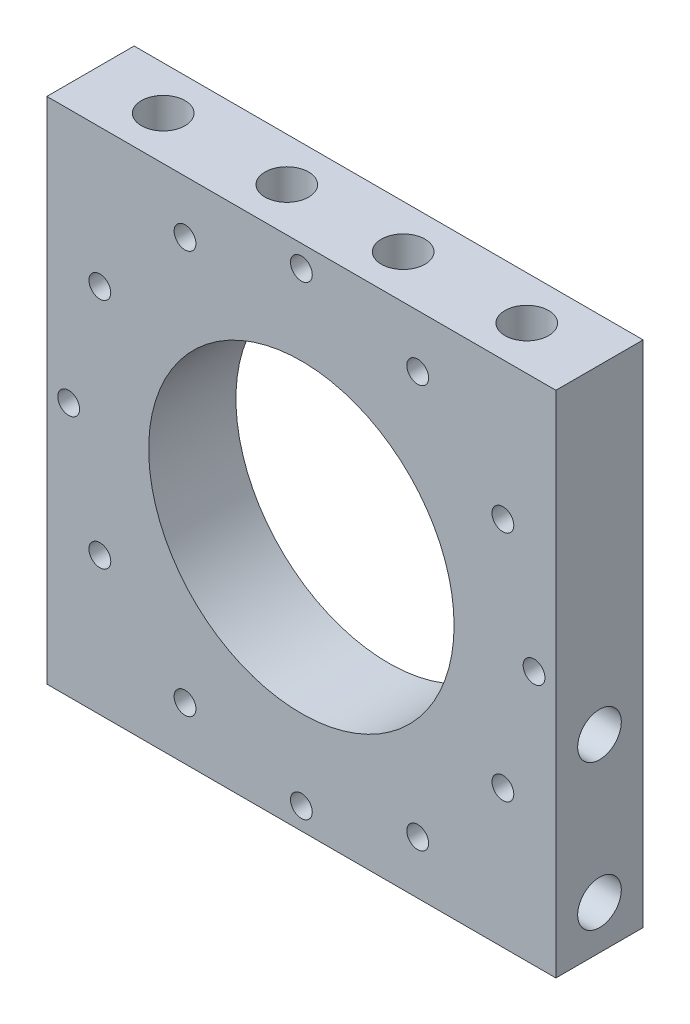
ISO-10303-21;
HEADER;
FILE_DESCRIPTION(('STEP AP214'),'2;1');
FILE_NAME('part.step','',(''),(''),'','','');
FILE_SCHEMA(('AUTOMOTIVE_DESIGN { 1 0 10303 214 1 1 1 1 }'));
ENDSEC;
DATA;
#1=APPLICATION_CONTEXT('core data for automotive mechanical design processes');
#2=APPLICATION_PROTOCOL_DEFINITION('international standard','automotive_design',2000,#1);
#3=PRODUCT_CONTEXT('',#1,'mechanical');
#4=PRODUCT('Part','Part','',(#3));
#5=PRODUCT_RELATED_PRODUCT_CATEGORY('part','',(#4));
#6=PRODUCT_DEFINITION_FORMATION('','',#4);
#7=PRODUCT_DEFINITION_CONTEXT('part definition',#1,'design');
#8=PRODUCT_DEFINITION('design','',#6,#7);
#9=PRODUCT_DEFINITION_SHAPE('','',#8);
#10=(LENGTH_UNIT() NAMED_UNIT(*) SI_UNIT(.MILLI.,.METRE.));
#11=(NAMED_UNIT(*) PLANE_ANGLE_UNIT() SI_UNIT($,.RADIAN.));
#12=(NAMED_UNIT(*) SI_UNIT($,.STERADIAN.) SOLID_ANGLE_UNIT());
#13=UNCERTAINTY_MEASURE_WITH_UNIT(LENGTH_MEASURE(1.E-05),#10,'distance_accuracy_value','');
#14=(GEOMETRIC_REPRESENTATION_CONTEXT(3) GLOBAL_UNCERTAINTY_ASSIGNED_CONTEXT((#13)) GLOBAL_UNIT_ASSIGNED_CONTEXT((#10,
#11,#12)) REPRESENTATION_CONTEXT('',''));
#15=CARTESIAN_POINT('',(0.,0.,0.));
#16=DIRECTION('',(0.,0.,1.));
#17=DIRECTION('',(1.,0.,0.));
#18=AXIS2_PLACEMENT_3D('',#15,#16,#17);
#19=CARTESIAN_POINT('',(0.,0.,12.));
#20=DIRECTION('',(0.,0.,-1.));
#21=DIRECTION('',(-1.,0.,0.));
#22=AXIS2_PLACEMENT_3D('',#19,#20,#21);
#23=PLANE('',#22);
#24=DIRECTION('',(0.,1.,0.));
#25=VECTOR('',#24,1.);
#26=CARTESIAN_POINT('',(35.,-35.,12.));
#27=LINE('',#26,#25);
#28=CARTESIAN_POINT('',(35.,-35.,12.));
#29=VERTEX_POINT('',#28);
#30=CARTESIAN_POINT('',(35.,35.,12.));
#31=VERTEX_POINT('',#30);
#32=EDGE_CURVE('E85',#29,#31,#27,.T.);
#33=ORIENTED_EDGE('',*,*,#32,.T.);
#34=DIRECTION('',(-1.,0.,0.));
#35=VECTOR('',#34,1.);
#36=CARTESIAN_POINT('',(-35.,35.,12.));
#37=LINE('',#36,#35);
#38=CARTESIAN_POINT('',(-35.,35.,12.));
#39=VERTEX_POINT('',#38);
#40=EDGE_CURVE('E80',#31,#39,#37,.T.);
#41=ORIENTED_EDGE('',*,*,#40,.T.);
#42=DIRECTION('',(0.,-1.,0.));
#43=VECTOR('',#42,1.);
#44=CARTESIAN_POINT('',(-35.,-35.,12.));
#45=LINE('',#44,#43);
#46=CARTESIAN_POINT('',(-35.,-35.,12.));
#47=VERTEX_POINT('',#46);
#48=EDGE_CURVE('E83',#39,#47,#45,.T.);
#49=ORIENTED_EDGE('',*,*,#48,.T.);
#50=DIRECTION('',(1.,0.,0.));
#51=VECTOR('',#50,1.);
#52=CARTESIAN_POINT('',(-35.,-35.,12.));
#53=LINE('',#52,#51);
#54=EDGE_CURVE('E50',#47,#29,#53,.T.);
#55=ORIENTED_EDGE('',*,*,#54,.T.);
#56=EDGE_LOOP('',(#33,#41,#49,#55));
#57=FACE_BOUND('',#56,.T.);
#58=CARTESIAN_POINT('',(-16.,27.712812921102,12.));
#59=DIRECTION('',(0.,0.,1.));
#60=DIRECTION('',(1.,0.,0.));
#61=AXIS2_PLACEMENT_3D('',#58,#59,#60);
#62=CIRCLE('',#61,1.5);
#63=CARTESIAN_POINT('',(-14.5,27.712812921102,12.));
#64=VERTEX_POINT('',#63);
#65=EDGE_CURVE('E100',#64,#64,#62,.T.);
#66=ORIENTED_EDGE('',*,*,#65,.F.);
#67=EDGE_LOOP('',(#66));
#68=FACE_BOUND('',#67,.T.);
#69=CARTESIAN_POINT('',(0.,32.,12.));
#70=DIRECTION('',(0.,0.,1.));
#71=DIRECTION('',(1.,0.,0.));
#72=AXIS2_PLACEMENT_3D('',#69,#70,#71);
#73=CIRCLE('',#72,1.5);
#74=CARTESIAN_POINT('',(1.5,32.,12.));
#75=VERTEX_POINT('',#74);
#76=EDGE_CURVE('E115',#75,#75,#73,.T.);
#77=ORIENTED_EDGE('',*,*,#76,.F.);
#78=EDGE_LOOP('',(#77));
#79=FACE_BOUND('',#78,.T.);
#80=CARTESIAN_POINT('',(16.,27.7128129211021,12.));
#81=DIRECTION('',(0.,0.,1.));
#82=DIRECTION('',(1.,0.,0.));
#83=AXIS2_PLACEMENT_3D('',#80,#81,#82);
#84=CIRCLE('',#83,1.5);
#85=CARTESIAN_POINT('',(17.5,27.7128129211021,12.));
#86=VERTEX_POINT('',#85);
#87=EDGE_CURVE('E121',#86,#86,#84,.T.);
#88=ORIENTED_EDGE('',*,*,#87,.F.);
#89=EDGE_LOOP('',(#88));
#90=FACE_BOUND('',#89,.T.);
#91=CARTESIAN_POINT('',(27.712812921102,16.,12.));
#92=DIRECTION('',(0.,0.,1.));
#93=DIRECTION('',(1.,0.,0.));
#94=AXIS2_PLACEMENT_3D('',#91,#92,#93);
#95=CIRCLE('',#94,1.5);
#96=CARTESIAN_POINT('',(29.212812921102,16.,12.));
#97=VERTEX_POINT('',#96);
#98=EDGE_CURVE('E127',#97,#97,#95,.T.);
#99=ORIENTED_EDGE('',*,*,#98,.F.);
#100=EDGE_LOOP('',(#99));
#101=FACE_BOUND('',#100,.T.);
#102=CARTESIAN_POINT('',(32.,0.,12.));
#103=DIRECTION('',(0.,0.,1.));
#104=DIRECTION('',(1.,0.,0.));
#105=AXIS2_PLACEMENT_3D('',#102,#103,#104);
#106=CIRCLE('',#105,1.5);
#107=CARTESIAN_POINT('',(33.5,0.,12.));
#108=VERTEX_POINT('',#107);
#109=EDGE_CURVE('E133',#108,#108,#106,.T.);
#110=ORIENTED_EDGE('',*,*,#109,.F.);
#111=EDGE_LOOP('',(#110));
#112=FACE_BOUND('',#111,.T.);
#113=CARTESIAN_POINT('',(0.,0.,12.));
#114=DIRECTION('',(0.,0.,1.));
#115=DIRECTION('',(1.,0.,0.));
#116=AXIS2_PLACEMENT_3D('',#113,#114,#115);
#117=CIRCLE('',#116,21.);
#118=CARTESIAN_POINT('',(21.,0.,12.));
#119=VERTEX_POINT('',#118);
#120=EDGE_CURVE('E139',#119,#119,#117,.T.);
#121=ORIENTED_EDGE('',*,*,#120,.F.);
#122=EDGE_LOOP('',(#121));
#123=FACE_BOUND('',#122,.T.);
#124=CARTESIAN_POINT('',(27.712812921102,-16.,12.));
#125=DIRECTION('',(0.,0.,1.));
#126=DIRECTION('',(1.,0.,0.));
#127=AXIS2_PLACEMENT_3D('',#124,#125,#126);
#128=CIRCLE('',#127,1.5);
#129=CARTESIAN_POINT('',(29.212812921102,-16.,12.));
#130=VERTEX_POINT('',#129);
#131=EDGE_CURVE('E145',#130,#130,#128,.T.);
#132=ORIENTED_EDGE('',*,*,#131,.F.);
#133=EDGE_LOOP('',(#132));
#134=FACE_BOUND('',#133,.T.);
#135=CARTESIAN_POINT('',(16.,-27.712812921102,12.));
#136=DIRECTION('',(0.,0.,1.));
#137=DIRECTION('',(1.,0.,0.));
#138=AXIS2_PLACEMENT_3D('',#135,#136,#137);
#139=CIRCLE('',#138,1.5);
#140=CARTESIAN_POINT('',(17.5,-27.712812921102,12.));
#141=VERTEX_POINT('',#140);
#142=EDGE_CURVE('E151',#141,#141,#139,.T.);
#143=ORIENTED_EDGE('',*,*,#142,.F.);
#144=EDGE_LOOP('',(#143));
#145=FACE_BOUND('',#144,.T.);
#146=CARTESIAN_POINT('',(0.,-32.,12.));
#147=DIRECTION('',(0.,0.,1.));
#148=DIRECTION('',(1.,0.,0.));
#149=AXIS2_PLACEMENT_3D('',#146,#147,#148);
#150=CIRCLE('',#149,1.5);
#151=CARTESIAN_POINT('',(1.5,-32.,12.));
#152=VERTEX_POINT('',#151);
#153=EDGE_CURVE('E157',#152,#152,#150,.T.);
#154=ORIENTED_EDGE('',*,*,#153,.F.);
#155=EDGE_LOOP('',(#154));
#156=FACE_BOUND('',#155,.T.);
#157=CARTESIAN_POINT('',(-16.,-27.712812921102,12.));
#158=DIRECTION('',(0.,0.,1.));
#159=DIRECTION('',(1.,0.,0.));
#160=AXIS2_PLACEMENT_3D('',#157,#158,#159);
#161=CIRCLE('',#160,1.5);
#162=CARTESIAN_POINT('',(-14.5,-27.712812921102,12.));
#163=VERTEX_POINT('',#162);
#164=EDGE_CURVE('E163',#163,#163,#161,.T.);
#165=ORIENTED_EDGE('',*,*,#164,.F.);
#166=EDGE_LOOP('',(#165));
#167=FACE_BOUND('',#166,.T.);
#168=CARTESIAN_POINT('',(-27.712812921102,-16.,12.));
#169=DIRECTION('',(0.,0.,1.));
#170=DIRECTION('',(1.,0.,0.));
#171=AXIS2_PLACEMENT_3D('',#168,#169,#170);
#172=CIRCLE('',#171,1.5);
#173=CARTESIAN_POINT('',(-26.212812921102,-16.,12.));
#174=VERTEX_POINT('',#173);
#175=EDGE_CURVE('E169',#174,#174,#172,.T.);
#176=ORIENTED_EDGE('',*,*,#175,.F.);
#177=EDGE_LOOP('',(#176));
#178=FACE_BOUND('',#177,.T.);
#179=CARTESIAN_POINT('',(-32.,0.,12.));
#180=DIRECTION('',(0.,0.,1.));
#181=DIRECTION('',(1.,0.,0.));
#182=AXIS2_PLACEMENT_3D('',#179,#180,#181);
#183=CIRCLE('',#182,1.5);
#184=CARTESIAN_POINT('',(-30.5,0.,12.));
#185=VERTEX_POINT('',#184);
#186=EDGE_CURVE('E175',#185,#185,#183,.T.);
#187=ORIENTED_EDGE('',*,*,#186,.F.);
#188=EDGE_LOOP('',(#187));
#189=FACE_BOUND('',#188,.T.);
#190=CARTESIAN_POINT('',(-27.712812921102,16.,12.));
#191=DIRECTION('',(0.,0.,1.));
#192=DIRECTION('',(1.,0.,0.));
#193=AXIS2_PLACEMENT_3D('',#190,#191,#192);
#194=CIRCLE('',#193,1.5);
#195=CARTESIAN_POINT('',(-26.212812921102,16.,12.));
#196=VERTEX_POINT('',#195);
#197=EDGE_CURVE('E181',#196,#196,#194,.T.);
#198=ORIENTED_EDGE('',*,*,#197,.F.);
#199=EDGE_LOOP('',(#198));
#200=FACE_BOUND('',#199,.T.);
#201=ADVANCED_FACE('F33',(#57,#68,#79,#90,#101,#112,#123,#134,#145,#156,#167,#178,#189,#200),
#23,.F.);
#202=CARTESIAN_POINT('',(0.,0.,0.));
#203=DIRECTION('',(0.,0.,-1.));
#204=DIRECTION('',(-1.,0.,0.));
#205=AXIS2_PLACEMENT_3D('',#202,#203,#204);
#206=PLANE('',#205);
#207=CARTESIAN_POINT('',(-32.,0.,0.));
#208=DIRECTION('',(0.,0.,1.));
#209=DIRECTION('',(1.,0.,0.));
#210=AXIS2_PLACEMENT_3D('',#207,#208,#209);
#211=CIRCLE('',#210,1.5);
#212=CARTESIAN_POINT('',(-30.5,0.,0.));
#213=VERTEX_POINT('',#212);
#214=EDGE_CURVE('E178',#213,#213,#211,.T.);
#215=ORIENTED_EDGE('',*,*,#214,.T.);
#216=EDGE_LOOP('',(#215));
#217=FACE_BOUND('',#216,.T.);
#218=CARTESIAN_POINT('',(-16.,-27.712812921102,0.));
#219=DIRECTION('',(0.,0.,1.));
#220=DIRECTION('',(1.,0.,0.));
#221=AXIS2_PLACEMENT_3D('',#218,#219,#220);
#222=CIRCLE('',#221,1.5);
#223=CARTESIAN_POINT('',(-14.5,-27.712812921102,0.));
#224=VERTEX_POINT('',#223);
#225=EDGE_CURVE('E166',#224,#224,#222,.T.);
#226=ORIENTED_EDGE('',*,*,#225,.T.);
#227=EDGE_LOOP('',(#226));
#228=FACE_BOUND('',#227,.T.);
#229=CARTESIAN_POINT('',(16.,-27.712812921102,0.));
#230=DIRECTION('',(0.,0.,1.));
#231=DIRECTION('',(1.,0.,0.));
#232=AXIS2_PLACEMENT_3D('',#229,#230,#231);
#233=CIRCLE('',#232,1.5);
#234=CARTESIAN_POINT('',(17.5,-27.712812921102,0.));
#235=VERTEX_POINT('',#234);
#236=EDGE_CURVE('E154',#235,#235,#233,.T.);
#237=ORIENTED_EDGE('',*,*,#236,.T.);
#238=EDGE_LOOP('',(#237));
#239=FACE_BOUND('',#238,.T.);
#240=CARTESIAN_POINT('',(0.,0.,0.));
#241=DIRECTION('',(0.,0.,1.));
#242=DIRECTION('',(1.,0.,0.));
#243=AXIS2_PLACEMENT_3D('',#240,#241,#242);
#244=CIRCLE('',#243,21.);
#245=CARTESIAN_POINT('',(21.,0.,0.));
#246=VERTEX_POINT('',#245);
#247=EDGE_CURVE('E142',#246,#246,#244,.T.);
#248=ORIENTED_EDGE('',*,*,#247,.T.);
#249=EDGE_LOOP('',(#248));
#250=FACE_BOUND('',#249,.T.);
#251=CARTESIAN_POINT('',(27.712812921102,16.,0.));
#252=DIRECTION('',(0.,0.,1.));
#253=DIRECTION('',(1.,0.,0.));
#254=AXIS2_PLACEMENT_3D('',#251,#252,#253);
#255=CIRCLE('',#254,1.5);
#256=CARTESIAN_POINT('',(29.212812921102,16.,0.));
#257=VERTEX_POINT('',#256);
#258=EDGE_CURVE('E130',#257,#257,#255,.T.);
#259=ORIENTED_EDGE('',*,*,#258,.T.);
#260=EDGE_LOOP('',(#259));
#261=FACE_BOUND('',#260,.T.);
#262=CARTESIAN_POINT('',(0.,32.,0.));
#263=DIRECTION('',(0.,0.,1.));
#264=DIRECTION('',(1.,0.,0.));
#265=AXIS2_PLACEMENT_3D('',#262,#263,#264);
#266=CIRCLE('',#265,1.5);
#267=CARTESIAN_POINT('',(1.5,32.,0.));
#268=VERTEX_POINT('',#267);
#269=EDGE_CURVE('E118',#268,#268,#266,.T.);
#270=ORIENTED_EDGE('',*,*,#269,.T.);
#271=EDGE_LOOP('',(#270));
#272=FACE_BOUND('',#271,.T.);
#273=DIRECTION('',(0.,1.,0.));
#274=VECTOR('',#273,1.);
#275=CARTESIAN_POINT('',(35.,-35.,0.));
#276=LINE('',#275,#274);
#277=CARTESIAN_POINT('',(35.,-35.,0.));
#278=VERTEX_POINT('',#277);
#279=CARTESIAN_POINT('',(35.,35.,0.));
#280=VERTEX_POINT('',#279);
#281=EDGE_CURVE('E97',#278,#280,#276,.T.);
#282=ORIENTED_EDGE('',*,*,#281,.F.);
#283=DIRECTION('',(1.,0.,0.));
#284=VECTOR('',#283,1.);
#285=CARTESIAN_POINT('',(-35.,-35.,0.));
#286=LINE('',#285,#284);
#287=CARTESIAN_POINT('',(-35.,-35.,0.));
#288=VERTEX_POINT('',#287);
#289=EDGE_CURVE('E73',#288,#278,#286,.T.);
#290=ORIENTED_EDGE('',*,*,#289,.F.);
#291=DIRECTION('',(0.,-1.,0.));
#292=VECTOR('',#291,1.);
#293=CARTESIAN_POINT('',(-35.,-35.,0.));
#294=LINE('',#293,#292);
#295=CARTESIAN_POINT('',(-35.,35.,0.));
#296=VERTEX_POINT('',#295);
#297=EDGE_CURVE('E67',#296,#288,#294,.T.);
#298=ORIENTED_EDGE('',*,*,#297,.F.);
#299=DIRECTION('',(-1.,0.,0.));
#300=VECTOR('',#299,1.);
#301=CARTESIAN_POINT('',(-35.,35.,0.));
#302=LINE('',#301,#300);
#303=EDGE_CURVE('E89',#280,#296,#302,.T.);
#304=ORIENTED_EDGE('',*,*,#303,.F.);
#305=EDGE_LOOP('',(#282,#290,#298,#304));
#306=FACE_BOUND('',#305,.T.);
#307=CARTESIAN_POINT('',(-16.,27.712812921102,0.));
#308=DIRECTION('',(0.,0.,1.));
#309=DIRECTION('',(1.,0.,0.));
#310=AXIS2_PLACEMENT_3D('',#307,#308,#309);
#311=CIRCLE('',#310,1.5);
#312=CARTESIAN_POINT('',(-14.5,27.712812921102,0.));
#313=VERTEX_POINT('',#312);
#314=EDGE_CURVE('E112',#313,#313,#311,.T.);
#315=ORIENTED_EDGE('',*,*,#314,.T.);
#316=EDGE_LOOP('',(#315));
#317=FACE_BOUND('',#316,.T.);
#318=CARTESIAN_POINT('',(16.,27.7128129211021,0.));
#319=DIRECTION('',(0.,0.,1.));
#320=DIRECTION('',(1.,0.,0.));
#321=AXIS2_PLACEMENT_3D('',#318,#319,#320);
#322=CIRCLE('',#321,1.5);
#323=CARTESIAN_POINT('',(17.5,27.7128129211021,0.));
#324=VERTEX_POINT('',#323);
#325=EDGE_CURVE('E124',#324,#324,#322,.T.);
#326=ORIENTED_EDGE('',*,*,#325,.T.);
#327=EDGE_LOOP('',(#326));
#328=FACE_BOUND('',#327,.T.);
#329=CARTESIAN_POINT('',(32.,0.,0.));
#330=DIRECTION('',(0.,0.,1.));
#331=DIRECTION('',(1.,0.,0.));
#332=AXIS2_PLACEMENT_3D('',#329,#330,#331);
#333=CIRCLE('',#332,1.5);
#334=CARTESIAN_POINT('',(33.5,0.,0.));
#335=VERTEX_POINT('',#334);
#336=EDGE_CURVE('E136',#335,#335,#333,.T.);
#337=ORIENTED_EDGE('',*,*,#336,.T.);
#338=EDGE_LOOP('',(#337));
#339=FACE_BOUND('',#338,.T.);
#340=CARTESIAN_POINT('',(27.712812921102,-16.,0.));
#341=DIRECTION('',(0.,0.,1.));
#342=DIRECTION('',(1.,0.,0.));
#343=AXIS2_PLACEMENT_3D('',#340,#341,#342);
#344=CIRCLE('',#343,1.5);
#345=CARTESIAN_POINT('',(29.212812921102,-16.,0.));
#346=VERTEX_POINT('',#345);
#347=EDGE_CURVE('E148',#346,#346,#344,.T.);
#348=ORIENTED_EDGE('',*,*,#347,.T.);
#349=EDGE_LOOP('',(#348));
#350=FACE_BOUND('',#349,.T.);
#351=CARTESIAN_POINT('',(0.,-32.,0.));
#352=DIRECTION('',(0.,0.,1.));
#353=DIRECTION('',(1.,0.,0.));
#354=AXIS2_PLACEMENT_3D('',#351,#352,#353);
#355=CIRCLE('',#354,1.5);
#356=CARTESIAN_POINT('',(1.5,-32.,0.));
#357=VERTEX_POINT('',#356);
#358=EDGE_CURVE('E160',#357,#357,#355,.T.);
#359=ORIENTED_EDGE('',*,*,#358,.T.);
#360=EDGE_LOOP('',(#359));
#361=FACE_BOUND('',#360,.T.);
#362=CARTESIAN_POINT('',(-27.712812921102,-16.,0.));
#363=DIRECTION('',(0.,0.,1.));
#364=DIRECTION('',(1.,0.,0.));
#365=AXIS2_PLACEMENT_3D('',#362,#363,#364);
#366=CIRCLE('',#365,1.5);
#367=CARTESIAN_POINT('',(-26.212812921102,-16.,0.));
#368=VERTEX_POINT('',#367);
#369=EDGE_CURVE('E172',#368,#368,#366,.T.);
#370=ORIENTED_EDGE('',*,*,#369,.T.);
#371=EDGE_LOOP('',(#370));
#372=FACE_BOUND('',#371,.T.);
#373=CARTESIAN_POINT('',(-27.712812921102,16.,0.));
#374=DIRECTION('',(0.,0.,1.));
#375=DIRECTION('',(1.,0.,0.));
#376=AXIS2_PLACEMENT_3D('',#373,#374,#375);
#377=CIRCLE('',#376,1.5);
#378=CARTESIAN_POINT('',(-26.212812921102,16.,0.));
#379=VERTEX_POINT('',#378);
#380=EDGE_CURVE('E184',#379,#379,#377,.T.);
#381=ORIENTED_EDGE('',*,*,#380,.T.);
#382=EDGE_LOOP('',(#381));
#383=FACE_BOUND('',#382,.T.);
#384=ADVANCED_FACE('F108',(#217,#228,#239,#250,#261,#272,#306,#317,#328,#339,#350,#361,#372,
#383),#206,.T.);
#385=CARTESIAN_POINT('',(35.,-35.,12.));
#386=DIRECTION('',(-1.,0.,0.));
#387=DIRECTION('',(0.,0.,1.));
#388=AXIS2_PLACEMENT_3D('',#385,#386,#387);
#389=PLANE('',#388);
#390=CARTESIAN_POINT('',(35.,-9.00000000000001,6.));
#391=DIRECTION('',(1.,0.,0.));
#392=DIRECTION('',(0.,0.,-1.));
#393=AXIS2_PLACEMENT_3D('',#390,#391,#392);
#394=CIRCLE('',#393,3.);
#395=CARTESIAN_POINT('',(35.,-9.00000000000001,3.));
#396=VERTEX_POINT('',#395);
#397=EDGE_CURVE('E221',#396,#396,#394,.T.);
#398=ORIENTED_EDGE('',*,*,#397,.F.);
#399=EDGE_LOOP('',(#398));
#400=FACE_BOUND('',#399,.T.);
#401=CARTESIAN_POINT('',(35.,-29.,6.));
#402=DIRECTION('',(1.,0.,0.));
#403=DIRECTION('',(0.,0.,-1.));
#404=AXIS2_PLACEMENT_3D('',#401,#402,#403);
#405=CIRCLE('',#404,3.);
#406=CARTESIAN_POINT('',(35.,-29.,3.));
#407=VERTEX_POINT('',#406);
#408=EDGE_CURVE('E214',#407,#407,#405,.T.);
#409=ORIENTED_EDGE('',*,*,#408,.F.);
#410=EDGE_LOOP('',(#409));
#411=FACE_BOUND('',#410,.T.);
#412=ORIENTED_EDGE('',*,*,#281,.T.);
#413=DIRECTION('',(0.,0.,-1.));
#414=VECTOR('',#413,1.);
#415=CARTESIAN_POINT('',(35.,35.,12.));
#416=LINE('',#415,#414);
#417=EDGE_CURVE('E11',#31,#280,#416,.T.);
#418=ORIENTED_EDGE('',*,*,#417,.F.);
#419=ORIENTED_EDGE('',*,*,#32,.F.);
#420=DIRECTION('',(0.,0.,-1.));
#421=VECTOR('',#420,1.);
#422=CARTESIAN_POINT('',(35.,-35.,12.));
#423=LINE('',#422,#421);
#424=EDGE_CURVE('E93',#29,#278,#423,.T.);
#425=ORIENTED_EDGE('',*,*,#424,.T.);
#426=EDGE_LOOP('',(#412,#418,#419,#425));
#427=FACE_BOUND('',#426,.T.);
#428=ADVANCED_FACE('F35',(#400,#411,#427),#389,.F.);
#429=CARTESIAN_POINT('',(-35.,35.,12.));
#430=DIRECTION('',(0.,-1.,0.));
#431=DIRECTION('',(0.,0.,-1.));
#432=AXIS2_PLACEMENT_3D('',#429,#430,#431);
#433=PLANE('',#432);
#434=CARTESIAN_POINT('',(-25.,35.,6.));
#435=DIRECTION('',(0.,1.,0.));
#436=DIRECTION('',(0.,0.,1.));
#437=AXIS2_PLACEMENT_3D('',#434,#435,#436);
#438=CIRCLE('',#437,3.);
#439=CARTESIAN_POINT('',(-25.,35.,9.));
#440=VERTEX_POINT('',#439);
#441=EDGE_CURVE('E203',#440,#440,#438,.T.);
#442=ORIENTED_EDGE('',*,*,#441,.F.);
#443=EDGE_LOOP('',(#442));
#444=FACE_BOUND('',#443,.T.);
#445=CARTESIAN_POINT('',(7.99999999999999,35.,6.));
#446=DIRECTION('',(0.,1.,0.));
#447=DIRECTION('',(0.,0.,-1.));
#448=AXIS2_PLACEMENT_3D('',#445,#446,#447);
#449=CIRCLE('',#448,3.);
#450=CARTESIAN_POINT('',(7.99999999999999,35.,3.));
#451=VERTEX_POINT('',#450);
#452=EDGE_CURVE('E204',#451,#451,#449,.T.);
#453=ORIENTED_EDGE('',*,*,#452,.F.);
#454=EDGE_LOOP('',(#453));
#455=FACE_BOUND('',#454,.T.);
#456=CARTESIAN_POINT('',(25.,35.,6.));
#457=DIRECTION('',(0.,1.,0.));
#458=DIRECTION('',(0.,0.,-1.));
#459=AXIS2_PLACEMENT_3D('',#456,#457,#458);
#460=CIRCLE('',#459,3.);
#461=CARTESIAN_POINT('',(25.,35.,3.));
#462=VERTEX_POINT('',#461);
#463=EDGE_CURVE('E190',#462,#462,#460,.T.);
#464=ORIENTED_EDGE('',*,*,#463,.F.);
#465=EDGE_LOOP('',(#464));
#466=FACE_BOUND('',#465,.T.);
#467=CARTESIAN_POINT('',(-7.99999999999999,35.,6.));
#468=DIRECTION('',(0.,1.,0.));
#469=DIRECTION('',(0.,0.,1.));
#470=AXIS2_PLACEMENT_3D('',#467,#468,#469);
#471=CIRCLE('',#470,3.);
#472=CARTESIAN_POINT('',(-7.99999999999999,35.,9.));
#473=VERTEX_POINT('',#472);
#474=EDGE_CURVE('E197',#473,#473,#471,.T.);
#475=ORIENTED_EDGE('',*,*,#474,.F.);
#476=EDGE_LOOP('',(#475));
#477=FACE_BOUND('',#476,.T.);
#478=ORIENTED_EDGE('',*,*,#303,.T.);
#479=DIRECTION('',(0.,0.,-1.));
#480=VECTOR('',#479,1.);
#481=CARTESIAN_POINT('',(-35.,35.,12.));
#482=LINE('',#481,#480);
#483=EDGE_CURVE('E42',#39,#296,#482,.T.);
#484=ORIENTED_EDGE('',*,*,#483,.F.);
#485=ORIENTED_EDGE('',*,*,#40,.F.);
#486=ORIENTED_EDGE('',*,*,#417,.T.);
#487=EDGE_LOOP('',(#478,#484,#485,#486));
#488=FACE_BOUND('',#487,.T.);
#489=ADVANCED_FACE('F88',(#444,#455,#466,#477,#488),#433,.F.);
#490=CARTESIAN_POINT('',(-35.,-35.,12.));
#491=DIRECTION('',(1.,0.,0.));
#492=DIRECTION('',(0.,0.,-1.));
#493=AXIS2_PLACEMENT_3D('',#490,#491,#492);
#494=PLANE('',#493);
#495=CARTESIAN_POINT('',(-35.,-29.,6.));
#496=DIRECTION('',(-1.,0.,0.));
#497=DIRECTION('',(0.,0.,1.));
#498=AXIS2_PLACEMENT_3D('',#495,#496,#497);
#499=CIRCLE('',#498,3.);
#500=CARTESIAN_POINT('',(-35.,-29.,9.));
#501=VERTEX_POINT('',#500);
#502=EDGE_CURVE('E233',#501,#501,#499,.T.);
#503=ORIENTED_EDGE('',*,*,#502,.F.);
#504=EDGE_LOOP('',(#503));
#505=FACE_BOUND('',#504,.T.);
#506=CARTESIAN_POINT('',(-35.,-9.00000000000001,6.));
#507=DIRECTION('',(-1.,0.,0.));
#508=DIRECTION('',(0.,0.,1.));
#509=AXIS2_PLACEMENT_3D('',#506,#507,#508);
#510=CIRCLE('',#509,3.);
#511=CARTESIAN_POINT('',(-35.,-9.00000000000001,9.));
#512=VERTEX_POINT('',#511);
#513=EDGE_CURVE('E226',#512,#512,#510,.T.);
#514=ORIENTED_EDGE('',*,*,#513,.F.);
#515=EDGE_LOOP('',(#514));
#516=FACE_BOUND('',#515,.T.);
#517=ORIENTED_EDGE('',*,*,#297,.T.);
#518=DIRECTION('',(0.,0.,-1.));
#519=VECTOR('',#518,1.);
#520=CARTESIAN_POINT('',(-35.,-35.,12.));
#521=LINE('',#520,#519);
#522=EDGE_CURVE('E90',#47,#288,#521,.T.);
#523=ORIENTED_EDGE('',*,*,#522,.F.);
#524=ORIENTED_EDGE('',*,*,#48,.F.);
#525=ORIENTED_EDGE('',*,*,#483,.T.);
#526=EDGE_LOOP('',(#517,#523,#524,#525));
#527=FACE_BOUND('',#526,.T.);
#528=ADVANCED_FACE('F91',(#505,#516,#527),#494,.F.);
#529=CARTESIAN_POINT('',(-35.,-35.,12.));
#530=DIRECTION('',(0.,1.,0.));
#531=DIRECTION('',(0.,0.,1.));
#532=AXIS2_PLACEMENT_3D('',#529,#530,#531);
#533=PLANE('',#532);
#534=CARTESIAN_POINT('',(10.,-35.,6.));
#535=DIRECTION('',(0.,-1.,0.));
#536=DIRECTION('',(0.,0.,-1.));
#537=AXIS2_PLACEMENT_3D('',#534,#535,#536);
#538=CIRCLE('',#537,3.);
#539=CARTESIAN_POINT('',(10.,-35.,3.));
#540=VERTEX_POINT('',#539);
#541=EDGE_CURVE('E244',#540,#540,#538,.T.);
#542=ORIENTED_EDGE('',*,*,#541,.F.);
#543=EDGE_LOOP('',(#542));
#544=FACE_BOUND('',#543,.T.);
#545=CARTESIAN_POINT('',(-9.99999999999999,-35.,6.));
#546=DIRECTION('',(0.,-1.,0.));
#547=DIRECTION('',(0.,0.,-1.));
#548=AXIS2_PLACEMENT_3D('',#545,#546,#547);
#549=CIRCLE('',#548,3.);
#550=CARTESIAN_POINT('',(-9.99999999999999,-35.,3.));
#551=VERTEX_POINT('',#550);
#552=EDGE_CURVE('E238',#551,#551,#549,.T.);
#553=ORIENTED_EDGE('',*,*,#552,.F.);
#554=EDGE_LOOP('',(#553));
#555=FACE_BOUND('',#554,.T.);
#556=ORIENTED_EDGE('',*,*,#289,.T.);
#557=ORIENTED_EDGE('',*,*,#424,.F.);
#558=ORIENTED_EDGE('',*,*,#54,.F.);
#559=ORIENTED_EDGE('',*,*,#522,.T.);
#560=EDGE_LOOP('',(#556,#557,#558,#559));
#561=FACE_BOUND('',#560,.T.);
#562=ADVANCED_FACE('F105',(#544,#555,#561),#533,.F.);
#563=CARTESIAN_POINT('',(-16.,27.712812921102,12.));
#564=DIRECTION('',(0.,0.,-1.));
#565=DIRECTION('',(-1.,0.,0.));
#566=AXIS2_PLACEMENT_3D('',#563,#564,#565);
#567=CYLINDRICAL_SURFACE('',#566,1.5);
#568=ORIENTED_EDGE('',*,*,#65,.T.);
#569=EDGE_LOOP('',(#568));
#570=FACE_BOUND('',#569,.T.);
#571=ORIENTED_EDGE('',*,*,#314,.F.);
#572=EDGE_LOOP('',(#571));
#573=FACE_BOUND('',#572,.T.);
#574=ADVANCED_FACE('F261',(#570,#573),#567,.F.);
#575=CARTESIAN_POINT('',(0.,32.,12.));
#576=DIRECTION('',(0.,0.,-1.));
#577=DIRECTION('',(-1.,0.,0.));
#578=AXIS2_PLACEMENT_3D('',#575,#576,#577);
#579=CYLINDRICAL_SURFACE('',#578,1.5);
#580=ORIENTED_EDGE('',*,*,#76,.T.);
#581=EDGE_LOOP('',(#580));
#582=FACE_BOUND('',#581,.T.);
#583=ORIENTED_EDGE('',*,*,#269,.F.);
#584=EDGE_LOOP('',(#583));
#585=FACE_BOUND('',#584,.T.);
#586=ADVANCED_FACE('F370',(#582,#585),#579,.F.);
#587=CARTESIAN_POINT('',(16.,27.7128129211021,12.));
#588=DIRECTION('',(0.,0.,-1.));
#589=DIRECTION('',(-1.,0.,0.));
#590=AXIS2_PLACEMENT_3D('',#587,#588,#589);
#591=CYLINDRICAL_SURFACE('',#590,1.5);
#592=ORIENTED_EDGE('',*,*,#87,.T.);
#593=EDGE_LOOP('',(#592));
#594=FACE_BOUND('',#593,.T.);
#595=ORIENTED_EDGE('',*,*,#325,.F.);
#596=EDGE_LOOP('',(#595));
#597=FACE_BOUND('',#596,.T.);
#598=ADVANCED_FACE('F367',(#594,#597),#591,.F.);
#599=CARTESIAN_POINT('',(27.712812921102,16.,12.));
#600=DIRECTION('',(0.,0.,-1.));
#601=DIRECTION('',(-1.,0.,0.));
#602=AXIS2_PLACEMENT_3D('',#599,#600,#601);
#603=CYLINDRICAL_SURFACE('',#602,1.5);
#604=ORIENTED_EDGE('',*,*,#98,.T.);
#605=EDGE_LOOP('',(#604));
#606=FACE_BOUND('',#605,.T.);
#607=ORIENTED_EDGE('',*,*,#258,.F.);
#608=EDGE_LOOP('',(#607));
#609=FACE_BOUND('',#608,.T.);
#610=ADVANCED_FACE('F363',(#606,#609),#603,.F.);
#611=CARTESIAN_POINT('',(32.,0.,12.));
#612=DIRECTION('',(0.,0.,-1.));
#613=DIRECTION('',(-1.,0.,0.));
#614=AXIS2_PLACEMENT_3D('',#611,#612,#613);
#615=CYLINDRICAL_SURFACE('',#614,1.5);
#616=ORIENTED_EDGE('',*,*,#109,.T.);
#617=EDGE_LOOP('',(#616));
#618=FACE_BOUND('',#617,.T.);
#619=ORIENTED_EDGE('',*,*,#336,.F.);
#620=EDGE_LOOP('',(#619));
#621=FACE_BOUND('',#620,.T.);
#622=ADVANCED_FACE('F359',(#618,#621),#615,.F.);
#623=CARTESIAN_POINT('',(0.,0.,12.));
#624=DIRECTION('',(0.,0.,-1.));
#625=DIRECTION('',(-1.,0.,0.));
#626=AXIS2_PLACEMENT_3D('',#623,#624,#625);
#627=CYLINDRICAL_SURFACE('',#626,21.);
#628=ORIENTED_EDGE('',*,*,#120,.T.);
#629=EDGE_LOOP('',(#628));
#630=FACE_BOUND('',#629,.T.);
#631=ORIENTED_EDGE('',*,*,#247,.F.);
#632=EDGE_LOOP('',(#631));
#633=FACE_BOUND('',#632,.T.);
#634=ADVANCED_FACE('F355',(#630,#633),#627,.F.);
#635=CARTESIAN_POINT('',(27.712812921102,-16.,12.));
#636=DIRECTION('',(0.,0.,-1.));
#637=DIRECTION('',(-1.,0.,0.));
#638=AXIS2_PLACEMENT_3D('',#635,#636,#637);
#639=CYLINDRICAL_SURFACE('',#638,1.5);
#640=ORIENTED_EDGE('',*,*,#131,.T.);
#641=EDGE_LOOP('',(#640));
#642=FACE_BOUND('',#641,.T.);
#643=ORIENTED_EDGE('',*,*,#347,.F.);
#644=EDGE_LOOP('',(#643));
#645=FACE_BOUND('',#644,.T.);
#646=ADVANCED_FACE('F351',(#642,#645),#639,.F.);
#647=CARTESIAN_POINT('',(16.,-27.712812921102,12.));
#648=DIRECTION('',(0.,0.,-1.));
#649=DIRECTION('',(-1.,0.,0.));
#650=AXIS2_PLACEMENT_3D('',#647,#648,#649);
#651=CYLINDRICAL_SURFACE('',#650,1.5);
#652=ORIENTED_EDGE('',*,*,#142,.T.);
#653=EDGE_LOOP('',(#652));
#654=FACE_BOUND('',#653,.T.);
#655=ORIENTED_EDGE('',*,*,#236,.F.);
#656=EDGE_LOOP('',(#655));
#657=FACE_BOUND('',#656,.T.);
#658=ADVANCED_FACE('F347',(#654,#657),#651,.F.);
#659=CARTESIAN_POINT('',(0.,-32.,12.));
#660=DIRECTION('',(0.,0.,-1.));
#661=DIRECTION('',(-1.,0.,0.));
#662=AXIS2_PLACEMENT_3D('',#659,#660,#661);
#663=CYLINDRICAL_SURFACE('',#662,1.5);
#664=ORIENTED_EDGE('',*,*,#153,.T.);
#665=EDGE_LOOP('',(#664));
#666=FACE_BOUND('',#665,.T.);
#667=ORIENTED_EDGE('',*,*,#358,.F.);
#668=EDGE_LOOP('',(#667));
#669=FACE_BOUND('',#668,.T.);
#670=ADVANCED_FACE('F343',(#666,#669),#663,.F.);
#671=CARTESIAN_POINT('',(-16.,-27.712812921102,12.));
#672=DIRECTION('',(0.,0.,-1.));
#673=DIRECTION('',(-1.,0.,0.));
#674=AXIS2_PLACEMENT_3D('',#671,#672,#673);
#675=CYLINDRICAL_SURFACE('',#674,1.5);
#676=ORIENTED_EDGE('',*,*,#164,.T.);
#677=EDGE_LOOP('',(#676));
#678=FACE_BOUND('',#677,.T.);
#679=ORIENTED_EDGE('',*,*,#225,.F.);
#680=EDGE_LOOP('',(#679));
#681=FACE_BOUND('',#680,.T.);
#682=ADVANCED_FACE('F339',(#678,#681),#675,.F.);
#683=CARTESIAN_POINT('',(-27.712812921102,-16.,12.));
#684=DIRECTION('',(0.,0.,-1.));
#685=DIRECTION('',(-1.,0.,0.));
#686=AXIS2_PLACEMENT_3D('',#683,#684,#685);
#687=CYLINDRICAL_SURFACE('',#686,1.5);
#688=ORIENTED_EDGE('',*,*,#175,.T.);
#689=EDGE_LOOP('',(#688));
#690=FACE_BOUND('',#689,.T.);
#691=ORIENTED_EDGE('',*,*,#369,.F.);
#692=EDGE_LOOP('',(#691));
#693=FACE_BOUND('',#692,.T.);
#694=ADVANCED_FACE('F335',(#690,#693),#687,.F.);
#695=CARTESIAN_POINT('',(-32.,0.,12.));
#696=DIRECTION('',(0.,0.,-1.));
#697=DIRECTION('',(-1.,0.,0.));
#698=AXIS2_PLACEMENT_3D('',#695,#696,#697);
#699=CYLINDRICAL_SURFACE('',#698,1.5);
#700=ORIENTED_EDGE('',*,*,#186,.T.);
#701=EDGE_LOOP('',(#700));
#702=FACE_BOUND('',#701,.T.);
#703=ORIENTED_EDGE('',*,*,#214,.F.);
#704=EDGE_LOOP('',(#703));
#705=FACE_BOUND('',#704,.T.);
#706=ADVANCED_FACE('F319',(#702,#705),#699,.F.);
#707=CARTESIAN_POINT('',(-27.712812921102,16.,12.));
#708=DIRECTION('',(0.,0.,-1.));
#709=DIRECTION('',(-1.,0.,0.));
#710=AXIS2_PLACEMENT_3D('',#707,#708,#709);
#711=CYLINDRICAL_SURFACE('',#710,1.5);
#712=ORIENTED_EDGE('',*,*,#197,.T.);
#713=EDGE_LOOP('',(#712));
#714=FACE_BOUND('',#713,.T.);
#715=ORIENTED_EDGE('',*,*,#380,.F.);
#716=EDGE_LOOP('',(#715));
#717=FACE_BOUND('',#716,.T.);
#718=ADVANCED_FACE('F309',(#714,#717),#711,.F.);
#719=CARTESIAN_POINT('',(-7.99999999999999,25.,6.));
#720=DIRECTION('',(0.,1.,0.));
#721=DIRECTION('',(0.,0.,1.));
#722=AXIS2_PLACEMENT_3D('',#719,#720,#721);
#723=CYLINDRICAL_SURFACE('',#722,3.);
#724=CARTESIAN_POINT('',(-7.99999999999999,25.,6.));
#725=DIRECTION('',(0.,1.,0.));
#726=DIRECTION('',(0.,0.,1.));
#727=AXIS2_PLACEMENT_3D('',#724,#725,#726);
#728=CIRCLE('',#727,3.);
#729=CARTESIAN_POINT('',(-7.99999999999999,25.,9.));
#730=VERTEX_POINT('',#729);
#731=EDGE_CURVE('E200',#730,#730,#728,.T.);
#732=ORIENTED_EDGE('',*,*,#731,.F.);
#733=EDGE_LOOP('',(#732));
#734=FACE_BOUND('',#733,.T.);
#735=ORIENTED_EDGE('',*,*,#474,.T.);
#736=EDGE_LOOP('',(#735));
#737=FACE_BOUND('',#736,.T.);
#738=ADVANCED_FACE('F306',(#734,#737),#723,.F.);
#739=CARTESIAN_POINT('',(-7.99999999999999,25.,6.));
#740=DIRECTION('',(0.,1.,0.));
#741=DIRECTION('',(0.,0.,1.));
#742=AXIS2_PLACEMENT_3D('',#739,#740,#741);
#743=PLANE('',#742);
#744=ORIENTED_EDGE('',*,*,#731,.T.);
#745=EDGE_LOOP('',(#744));
#746=FACE_BOUND('',#745,.T.);
#747=ADVANCED_FACE('F308',(#746),#743,.T.);
#748=CARTESIAN_POINT('',(25.,25.,6.));
#749=DIRECTION('',(0.,1.,0.));
#750=DIRECTION('',(0.,0.,1.));
#751=AXIS2_PLACEMENT_3D('',#748,#749,#750);
#752=CYLINDRICAL_SURFACE('',#751,3.);
#753=CARTESIAN_POINT('',(25.,25.,6.));
#754=DIRECTION('',(0.,1.,0.));
#755=DIRECTION('',(0.,0.,-1.));
#756=AXIS2_PLACEMENT_3D('',#753,#754,#755);
#757=CIRCLE('',#756,3.);
#758=CARTESIAN_POINT('',(25.,25.,3.));
#759=VERTEX_POINT('',#758);
#760=EDGE_CURVE('E193',#759,#759,#757,.T.);
#761=ORIENTED_EDGE('',*,*,#760,.F.);
#762=EDGE_LOOP('',(#761));
#763=FACE_BOUND('',#762,.T.);
#764=ORIENTED_EDGE('',*,*,#463,.T.);
#765=EDGE_LOOP('',(#764));
#766=FACE_BOUND('',#765,.T.);
#767=ADVANCED_FACE('F316',(#763,#766),#752,.F.);
#768=CARTESIAN_POINT('',(25.,25.,6.));
#769=DIRECTION('',(0.,-1.,0.));
#770=DIRECTION('',(0.,0.,-1.));
#771=AXIS2_PLACEMENT_3D('',#768,#769,#770);
#772=PLANE('',#771);
#773=ORIENTED_EDGE('',*,*,#760,.T.);
#774=EDGE_LOOP('',(#773));
#775=FACE_BOUND('',#774,.T.);
#776=ADVANCED_FACE('F325',(#775),#772,.F.);
#777=CARTESIAN_POINT('',(7.99999999999999,25.,6.));
#778=DIRECTION('',(0.,1.,0.));
#779=DIRECTION('',(0.,0.,1.));
#780=AXIS2_PLACEMENT_3D('',#777,#778,#779);
#781=CYLINDRICAL_SURFACE('',#780,3.);
#782=CARTESIAN_POINT('',(7.99999999999999,25.,6.));
#783=DIRECTION('',(0.,1.,0.));
#784=DIRECTION('',(0.,0.,-1.));
#785=AXIS2_PLACEMENT_3D('',#782,#783,#784);
#786=CIRCLE('',#785,3.);
#787=CARTESIAN_POINT('',(7.99999999999999,25.,3.));
#788=VERTEX_POINT('',#787);
#789=EDGE_CURVE('E194',#788,#788,#786,.T.);
#790=ORIENTED_EDGE('',*,*,#789,.F.);
#791=EDGE_LOOP('',(#790));
#792=FACE_BOUND('',#791,.T.);
#793=ORIENTED_EDGE('',*,*,#452,.T.);
#794=EDGE_LOOP('',(#793));
#795=FACE_BOUND('',#794,.T.);
#796=ADVANCED_FACE('F328',(#792,#795),#781,.F.);
#797=CARTESIAN_POINT('',(7.99999999999999,25.,6.));
#798=DIRECTION('',(0.,-1.,0.));
#799=DIRECTION('',(0.,0.,-1.));
#800=AXIS2_PLACEMENT_3D('',#797,#798,#799);
#801=PLANE('',#800);
#802=ORIENTED_EDGE('',*,*,#789,.T.);
#803=EDGE_LOOP('',(#802));
#804=FACE_BOUND('',#803,.T.);
#805=ADVANCED_FACE('F545',(#804),#801,.F.);
#806=CARTESIAN_POINT('',(-25.,25.,6.));
#807=DIRECTION('',(0.,1.,0.));
#808=DIRECTION('',(0.,0.,1.));
#809=AXIS2_PLACEMENT_3D('',#806,#807,#808);
#810=CYLINDRICAL_SURFACE('',#809,3.);
#811=CARTESIAN_POINT('',(-25.,25.,6.));
#812=DIRECTION('',(0.,1.,0.));
#813=DIRECTION('',(0.,0.,1.));
#814=AXIS2_PLACEMENT_3D('',#811,#812,#813);
#815=CIRCLE('',#814,3.);
#816=CARTESIAN_POINT('',(-25.,25.,9.));
#817=VERTEX_POINT('',#816);
#818=EDGE_CURVE('E187',#817,#817,#815,.T.);
#819=ORIENTED_EDGE('',*,*,#818,.F.);
#820=EDGE_LOOP('',(#819));
#821=FACE_BOUND('',#820,.T.);
#822=ORIENTED_EDGE('',*,*,#441,.T.);
#823=EDGE_LOOP('',(#822));
#824=FACE_BOUND('',#823,.T.);
#825=ADVANCED_FACE('F541',(#821,#824),#810,.F.);
#826=CARTESIAN_POINT('',(-25.,25.,6.));
#827=DIRECTION('',(0.,1.,0.));
#828=DIRECTION('',(0.,0.,1.));
#829=AXIS2_PLACEMENT_3D('',#826,#827,#828);
#830=PLANE('',#829);
#831=ORIENTED_EDGE('',*,*,#818,.T.);
#832=EDGE_LOOP('',(#831));
#833=FACE_BOUND('',#832,.T.);
#834=ADVANCED_FACE('F537',(#833),#830,.T.);
#835=CARTESIAN_POINT('',(25.,-29.,6.));
#836=DIRECTION('',(1.,0.,0.));
#837=DIRECTION('',(0.,0.,-1.));
#838=AXIS2_PLACEMENT_3D('',#835,#836,#837);
#839=CYLINDRICAL_SURFACE('',#838,3.);
#840=CARTESIAN_POINT('',(25.,-29.,6.));
#841=DIRECTION('',(1.,0.,0.));
#842=DIRECTION('',(0.,0.,-1.));
#843=AXIS2_PLACEMENT_3D('',#840,#841,#842);
#844=CIRCLE('',#843,3.);
#845=CARTESIAN_POINT('',(25.,-29.,3.));
#846=VERTEX_POINT('',#845);
#847=EDGE_CURVE('E217',#846,#846,#844,.T.);
#848=ORIENTED_EDGE('',*,*,#847,.F.);
#849=EDGE_LOOP('',(#848));
#850=FACE_BOUND('',#849,.T.);
#851=ORIENTED_EDGE('',*,*,#408,.T.);
#852=EDGE_LOOP('',(#851));
#853=FACE_BOUND('',#852,.T.);
#854=ADVANCED_FACE('F533',(#850,#853),#839,.F.);
#855=CARTESIAN_POINT('',(25.,-29.,6.));
#856=DIRECTION('',(1.,0.,0.));
#857=DIRECTION('',(0.,0.,-1.));
#858=AXIS2_PLACEMENT_3D('',#855,#856,#857);
#859=PLANE('',#858);
#860=ORIENTED_EDGE('',*,*,#847,.T.);
#861=EDGE_LOOP('',(#860));
#862=FACE_BOUND('',#861,.T.);
#863=ADVANCED_FACE('F529',(#862),#859,.T.);
#864=CARTESIAN_POINT('',(25.,-9.00000000000001,6.));
#865=DIRECTION('',(1.,0.,0.));
#866=DIRECTION('',(0.,0.,-1.));
#867=AXIS2_PLACEMENT_3D('',#864,#865,#866);
#868=CYLINDRICAL_SURFACE('',#867,3.);
#869=CARTESIAN_POINT('',(25.,-9.00000000000001,6.));
#870=DIRECTION('',(1.,0.,0.));
#871=DIRECTION('',(0.,0.,-1.));
#872=AXIS2_PLACEMENT_3D('',#869,#870,#871);
#873=CIRCLE('',#872,3.);
#874=CARTESIAN_POINT('',(25.,-9.00000000000001,3.));
#875=VERTEX_POINT('',#874);
#876=EDGE_CURVE('E207',#875,#875,#873,.T.);
#877=ORIENTED_EDGE('',*,*,#876,.F.);
#878=EDGE_LOOP('',(#877));
#879=FACE_BOUND('',#878,.T.);
#880=ORIENTED_EDGE('',*,*,#397,.T.);
#881=EDGE_LOOP('',(#880));
#882=FACE_BOUND('',#881,.T.);
#883=ADVANCED_FACE('F525',(#879,#882),#868,.F.);
#884=CARTESIAN_POINT('',(25.,-9.00000000000001,6.));
#885=DIRECTION('',(1.,0.,0.));
#886=DIRECTION('',(0.,0.,-1.));
#887=AXIS2_PLACEMENT_3D('',#884,#885,#886);
#888=PLANE('',#887);
#889=ORIENTED_EDGE('',*,*,#876,.T.);
#890=EDGE_LOOP('',(#889));
#891=FACE_BOUND('',#890,.T.);
#892=ADVANCED_FACE('F459',(#891),#888,.T.);
#893=CARTESIAN_POINT('',(-25.,-9.00000000000001,6.));
#894=DIRECTION('',(-1.,0.,0.));
#895=DIRECTION('',(0.,0.,1.));
#896=AXIS2_PLACEMENT_3D('',#893,#894,#895);
#897=CYLINDRICAL_SURFACE('',#896,3.);
#898=CARTESIAN_POINT('',(-25.,-9.00000000000001,6.));
#899=DIRECTION('',(-1.,0.,0.));
#900=DIRECTION('',(0.,0.,1.));
#901=AXIS2_PLACEMENT_3D('',#898,#899,#900);
#902=CIRCLE('',#901,3.);
#903=CARTESIAN_POINT('',(-25.,-9.00000000000001,9.));
#904=VERTEX_POINT('',#903);
#905=EDGE_CURVE('E229',#904,#904,#902,.T.);
#906=ORIENTED_EDGE('',*,*,#905,.F.);
#907=EDGE_LOOP('',(#906));
#908=FACE_BOUND('',#907,.T.);
#909=ORIENTED_EDGE('',*,*,#513,.T.);
#910=EDGE_LOOP('',(#909));
#911=FACE_BOUND('',#910,.T.);
#912=ADVANCED_FACE('F464',(#908,#911),#897,.F.);
#913=CARTESIAN_POINT('',(-25.,-9.00000000000001,6.));
#914=DIRECTION('',(-1.,0.,0.));
#915=DIRECTION('',(0.,0.,1.));
#916=AXIS2_PLACEMENT_3D('',#913,#914,#915);
#917=PLANE('',#916);
#918=ORIENTED_EDGE('',*,*,#905,.T.);
#919=EDGE_LOOP('',(#918));
#920=FACE_BOUND('',#919,.T.);
#921=ADVANCED_FACE('F469',(#920),#917,.T.);
#922=CARTESIAN_POINT('',(-25.,-29.,6.));
#923=DIRECTION('',(-1.,0.,0.));
#924=DIRECTION('',(0.,0.,1.));
#925=AXIS2_PLACEMENT_3D('',#922,#923,#924);
#926=CYLINDRICAL_SURFACE('',#925,3.);
#927=CARTESIAN_POINT('',(-25.,-29.,6.));
#928=DIRECTION('',(-1.,0.,0.));
#929=DIRECTION('',(0.,0.,1.));
#930=AXIS2_PLACEMENT_3D('',#927,#928,#929);
#931=CIRCLE('',#930,3.);
#932=CARTESIAN_POINT('',(-25.,-29.,9.));
#933=VERTEX_POINT('',#932);
#934=EDGE_CURVE('E218',#933,#933,#931,.T.);
#935=ORIENTED_EDGE('',*,*,#934,.F.);
#936=EDGE_LOOP('',(#935));
#937=FACE_BOUND('',#936,.T.);
#938=ORIENTED_EDGE('',*,*,#502,.T.);
#939=EDGE_LOOP('',(#938));
#940=FACE_BOUND('',#939,.T.);
#941=ADVANCED_FACE('F276',(#937,#940),#926,.F.);
#942=CARTESIAN_POINT('',(-25.,-29.,6.));
#943=DIRECTION('',(-1.,0.,0.));
#944=DIRECTION('',(0.,0.,1.));
#945=AXIS2_PLACEMENT_3D('',#942,#943,#944);
#946=PLANE('',#945);
#947=ORIENTED_EDGE('',*,*,#934,.T.);
#948=EDGE_LOOP('',(#947));
#949=FACE_BOUND('',#948,.T.);
#950=ADVANCED_FACE('F267',(#949),#946,.T.);
#951=CARTESIAN_POINT('',(-9.99999999999999,-25.,6.));
#952=DIRECTION('',(0.,-1.,0.));
#953=DIRECTION('',(0.,0.,-1.));
#954=AXIS2_PLACEMENT_3D('',#951,#952,#953);
#955=CYLINDRICAL_SURFACE('',#954,3.);
#956=CARTESIAN_POINT('',(-9.99999999999999,-25.,6.));
#957=DIRECTION('',(0.,-1.,0.));
#958=DIRECTION('',(0.,0.,-1.));
#959=AXIS2_PLACEMENT_3D('',#956,#957,#958);
#960=CIRCLE('',#959,3.);
#961=CARTESIAN_POINT('',(-9.99999999999999,-25.,3.));
#962=VERTEX_POINT('',#961);
#963=EDGE_CURVE('E241',#962,#962,#960,.T.);
#964=ORIENTED_EDGE('',*,*,#963,.F.);
#965=EDGE_LOOP('',(#964));
#966=FACE_BOUND('',#965,.T.);
#967=ORIENTED_EDGE('',*,*,#552,.T.);
#968=EDGE_LOOP('',(#967));
#969=FACE_BOUND('',#968,.T.);
#970=ADVANCED_FACE('F265',(#966,#969),#955,.F.);
#971=CARTESIAN_POINT('',(-9.99999999999999,-25.,6.));
#972=DIRECTION('',(0.,-1.,0.));
#973=DIRECTION('',(0.,0.,-1.));
#974=AXIS2_PLACEMENT_3D('',#971,#972,#973);
#975=PLANE('',#974);
#976=ORIENTED_EDGE('',*,*,#963,.T.);
#977=EDGE_LOOP('',(#976));
#978=FACE_BOUND('',#977,.T.);
#979=ADVANCED_FACE('F255',(#978),#975,.T.);
#980=CARTESIAN_POINT('',(10.,-25.,6.));
#981=DIRECTION('',(0.,-1.,0.));
#982=DIRECTION('',(0.,0.,-1.));
#983=AXIS2_PLACEMENT_3D('',#980,#981,#982);
#984=CYLINDRICAL_SURFACE('',#983,3.);
#985=CARTESIAN_POINT('',(10.,-25.,6.));
#986=DIRECTION('',(0.,-1.,0.));
#987=DIRECTION('',(0.,0.,-1.));
#988=AXIS2_PLACEMENT_3D('',#985,#986,#987);
#989=CIRCLE('',#988,3.);
#990=CARTESIAN_POINT('',(10.,-25.,3.));
#991=VERTEX_POINT('',#990);
#992=EDGE_CURVE('E230',#991,#991,#989,.T.);
#993=ORIENTED_EDGE('',*,*,#992,.F.);
#994=EDGE_LOOP('',(#993));
#995=FACE_BOUND('',#994,.T.);
#996=ORIENTED_EDGE('',*,*,#541,.T.);
#997=EDGE_LOOP('',(#996));
#998=FACE_BOUND('',#997,.T.);
#999=ADVANCED_FACE('F252',(#995,#998),#984,.F.);
#1000=CARTESIAN_POINT('',(10.,-25.,6.));
#1001=DIRECTION('',(0.,-1.,0.));
#1002=DIRECTION('',(0.,0.,-1.));
#1003=AXIS2_PLACEMENT_3D('',#1000,#1001,#1002);
#1004=PLANE('',#1003);
#1005=ORIENTED_EDGE('',*,*,#992,.T.);
#1006=EDGE_LOOP('',(#1005));
#1007=FACE_BOUND('',#1006,.T.);
#1008=ADVANCED_FACE('F250',(#1007),#1004,.T.);
#1009=CLOSED_SHELL('',(#201,#384,#428,#489,#528,#562,#574,#586,#598,#610,#622,#634,#646,#658,
#670,#682,#694,#706,#718,#738,#747,#767,#776,#796,#805,#825,#834,#854,#863,#883,#892,#912,#921,
#941,#950,#970,#979,#999,#1008));
#1010=MANIFOLD_SOLID_BREP('B2',#1009);
#1011=ADVANCED_BREP_SHAPE_REPRESENTATION('',(#18,#1010),#14);
#1012=SHAPE_DEFINITION_REPRESENTATION(#9,#1011);
ENDSEC;
END-ISO-10303-21;
